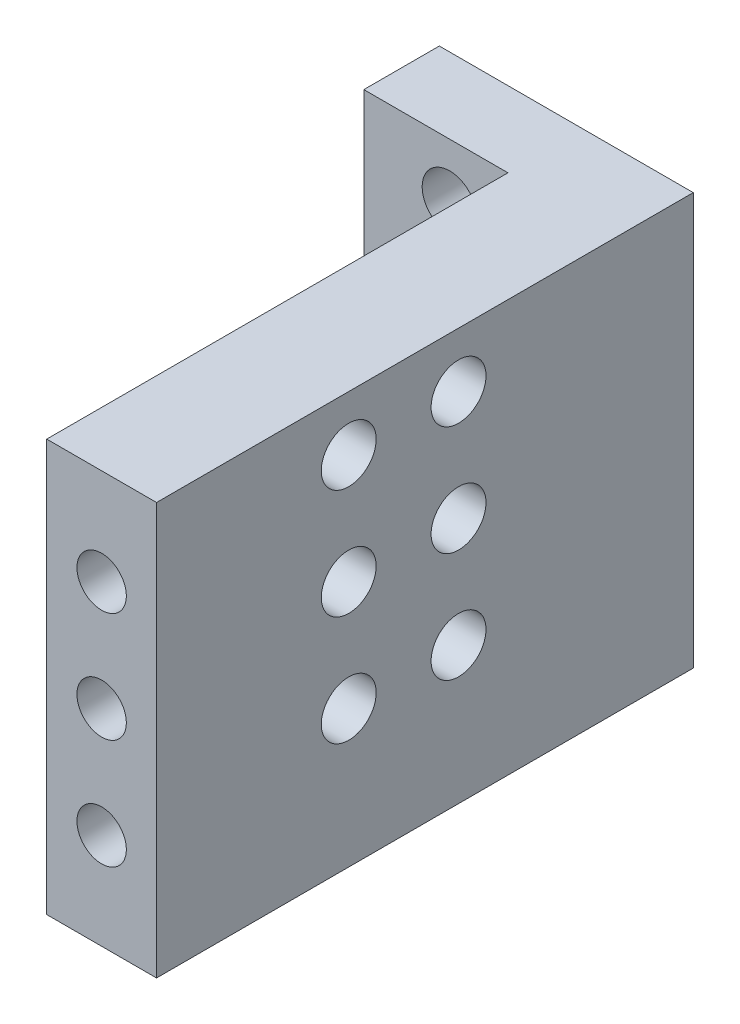
ISO-10303-21;
HEADER;
FILE_DESCRIPTION(('STEP AP214'),'2;1');
FILE_NAME('part.step','',(''),(''),'','','');
FILE_SCHEMA(('AUTOMOTIVE_DESIGN { 1 0 10303 214 1 1 1 1 }'));
ENDSEC;
DATA;
#1=APPLICATION_CONTEXT('core data for automotive mechanical design processes');
#2=APPLICATION_PROTOCOL_DEFINITION('international standard','automotive_design',2000,#1);
#3=PRODUCT_CONTEXT('',#1,'mechanical');
#4=PRODUCT('Part','Part','',(#3));
#5=PRODUCT_RELATED_PRODUCT_CATEGORY('part','',(#4));
#6=PRODUCT_DEFINITION_FORMATION('','',#4);
#7=PRODUCT_DEFINITION_CONTEXT('part definition',#1,'design');
#8=PRODUCT_DEFINITION('design','',#6,#7);
#9=PRODUCT_DEFINITION_SHAPE('','',#8);
#10=(LENGTH_UNIT() NAMED_UNIT(*) SI_UNIT(.MILLI.,.METRE.));
#11=(NAMED_UNIT(*) PLANE_ANGLE_UNIT() SI_UNIT($,.RADIAN.));
#12=(NAMED_UNIT(*) SI_UNIT($,.STERADIAN.) SOLID_ANGLE_UNIT());
#13=UNCERTAINTY_MEASURE_WITH_UNIT(LENGTH_MEASURE(1.E-05),#10,'distance_accuracy_value','');
#14=(GEOMETRIC_REPRESENTATION_CONTEXT(3) GLOBAL_UNCERTAINTY_ASSIGNED_CONTEXT((#13)) GLOBAL_UNIT_ASSIGNED_CONTEXT((#10,
#11,#12)) REPRESENTATION_CONTEXT('',''));
#15=CARTESIAN_POINT('',(0.,0.,0.));
#16=DIRECTION('',(0.,0.,1.));
#17=DIRECTION('',(1.,0.,0.));
#18=AXIS2_PLACEMENT_3D('',#15,#16,#17);
#19=CARTESIAN_POINT('',(8.,30.,0.));
#20=DIRECTION('',(0.,0.,-1.));
#21=DIRECTION('',(-1.,0.,0.));
#22=AXIS2_PLACEMENT_3D('',#19,#20,#21);
#23=PLANE('',#22);
#24=CARTESIAN_POINT('',(4.,23.,0.));
#25=DIRECTION('',(0.,0.,1.));
#26=DIRECTION('',(1.,0.,0.));
#27=AXIS2_PLACEMENT_3D('',#24,#25,#26);
#28=CIRCLE('',#27,1.8);
#29=CARTESIAN_POINT('',(5.8,23.,0.));
#30=VERTEX_POINT('',#29);
#31=EDGE_CURVE('E206',#30,#30,#28,.T.);
#32=ORIENTED_EDGE('',*,*,#31,.F.);
#33=EDGE_LOOP('',(#32));
#34=FACE_BOUND('',#33,.T.);
#35=CARTESIAN_POINT('',(4.,15.,0.));
#36=DIRECTION('',(0.,0.,1.));
#37=DIRECTION('',(1.,0.,0.));
#38=AXIS2_PLACEMENT_3D('',#35,#36,#37);
#39=CIRCLE('',#38,1.8);
#40=CARTESIAN_POINT('',(5.8,15.,0.));
#41=VERTEX_POINT('',#40);
#42=EDGE_CURVE('E210',#41,#41,#39,.T.);
#43=ORIENTED_EDGE('',*,*,#42,.F.);
#44=EDGE_LOOP('',(#43));
#45=FACE_BOUND('',#44,.T.);
#46=CARTESIAN_POINT('',(4.,7.,0.));
#47=DIRECTION('',(0.,0.,1.));
#48=DIRECTION('',(1.,0.,0.));
#49=AXIS2_PLACEMENT_3D('',#46,#47,#48);
#50=CIRCLE('',#49,1.8);
#51=CARTESIAN_POINT('',(5.8,7.,0.));
#52=VERTEX_POINT('',#51);
#53=EDGE_CURVE('E213',#52,#52,#50,.T.);
#54=ORIENTED_EDGE('',*,*,#53,.F.);
#55=EDGE_LOOP('',(#54));
#56=FACE_BOUND('',#55,.T.);
#57=DIRECTION('',(1.,0.,0.));
#58=VECTOR('',#57,1.);
#59=CARTESIAN_POINT('',(8.,0.,0.));
#60=LINE('',#59,#58);
#61=CARTESIAN_POINT('',(0.,0.,0.));
#62=VERTEX_POINT('',#61);
#63=CARTESIAN_POINT('',(8.,0.,0.));
#64=VERTEX_POINT('',#63);
#65=EDGE_CURVE('E120',#62,#64,#60,.T.);
#66=ORIENTED_EDGE('',*,*,#65,.T.);
#67=DIRECTION('',(0.,-1.,0.));
#68=VECTOR('',#67,1.);
#69=CARTESIAN_POINT('',(8.,30.,0.));
#70=LINE('',#69,#68);
#71=CARTESIAN_POINT('',(8.,30.,0.));
#72=VERTEX_POINT('',#71);
#73=EDGE_CURVE('E11',#72,#64,#70,.T.);
#74=ORIENTED_EDGE('',*,*,#73,.F.);
#75=DIRECTION('',(1.,0.,0.));
#76=VECTOR('',#75,1.);
#77=CARTESIAN_POINT('',(8.,30.,0.));
#78=LINE('',#77,#76);
#79=CARTESIAN_POINT('',(0.,30.,0.));
#80=VERTEX_POINT('',#79);
#81=EDGE_CURVE('E131',#80,#72,#78,.T.);
#82=ORIENTED_EDGE('',*,*,#81,.F.);
#83=DIRECTION('',(0.,-1.,0.));
#84=VECTOR('',#83,1.);
#85=CARTESIAN_POINT('',(0.,30.,0.));
#86=LINE('',#85,#84);
#87=EDGE_CURVE('E116',#80,#62,#86,.T.);
#88=ORIENTED_EDGE('',*,*,#87,.T.);
#89=EDGE_LOOP('',(#66,#74,#82,#88));
#90=FACE_BOUND('',#89,.T.);
#91=ADVANCED_FACE('F34',(#34,#45,#56,#90),#23,.F.);
#92=CARTESIAN_POINT('',(8.,30.,-39.1));
#93=DIRECTION('',(-1.,0.,0.));
#94=DIRECTION('',(0.,0.,1.));
#95=AXIS2_PLACEMENT_3D('',#92,#93,#94);
#96=PLANE('',#95);
#97=CARTESIAN_POINT('',(8.,18.,-14.));
#98=DIRECTION('',(1.,0.,0.));
#99=DIRECTION('',(0.,0.,-1.));
#100=AXIS2_PLACEMENT_3D('',#97,#98,#99);
#101=CIRCLE('',#100,2.);
#102=CARTESIAN_POINT('',(8.,18.,-16.));
#103=VERTEX_POINT('',#102);
#104=EDGE_CURVE('E226',#103,#103,#101,.T.);
#105=ORIENTED_EDGE('',*,*,#104,.F.);
#106=EDGE_LOOP('',(#105));
#107=FACE_BOUND('',#106,.T.);
#108=CARTESIAN_POINT('',(8.,10.,-14.));
#109=DIRECTION('',(1.,0.,0.));
#110=DIRECTION('',(0.,0.,-1.));
#111=AXIS2_PLACEMENT_3D('',#108,#109,#110);
#112=CIRCLE('',#111,2.);
#113=CARTESIAN_POINT('',(8.,10.,-16.));
#114=VERTEX_POINT('',#113);
#115=EDGE_CURVE('E229',#114,#114,#112,.T.);
#116=ORIENTED_EDGE('',*,*,#115,.F.);
#117=EDGE_LOOP('',(#116));
#118=FACE_BOUND('',#117,.T.);
#119=CARTESIAN_POINT('',(8.,26.,-22.));
#120=DIRECTION('',(1.,0.,0.));
#121=DIRECTION('',(0.,0.,-1.));
#122=AXIS2_PLACEMENT_3D('',#119,#120,#121);
#123=CIRCLE('',#122,2.00000000000001);
#124=CARTESIAN_POINT('',(8.,26.,-24.));
#125=VERTEX_POINT('',#124);
#126=EDGE_CURVE('E232',#125,#125,#123,.T.);
#127=ORIENTED_EDGE('',*,*,#126,.F.);
#128=EDGE_LOOP('',(#127));
#129=FACE_BOUND('',#128,.T.);
#130=CARTESIAN_POINT('',(8.,18.,-22.));
#131=DIRECTION('',(1.,0.,0.));
#132=DIRECTION('',(0.,0.,-1.));
#133=AXIS2_PLACEMENT_3D('',#130,#131,#132);
#134=CIRCLE('',#133,2.);
#135=CARTESIAN_POINT('',(8.,18.,-24.));
#136=VERTEX_POINT('',#135);
#137=EDGE_CURVE('E224',#136,#136,#134,.T.);
#138=ORIENTED_EDGE('',*,*,#137,.F.);
#139=EDGE_LOOP('',(#138));
#140=FACE_BOUND('',#139,.T.);
#141=CARTESIAN_POINT('',(8.,10.,-22.));
#142=DIRECTION('',(1.,0.,0.));
#143=DIRECTION('',(0.,0.,-1.));
#144=AXIS2_PLACEMENT_3D('',#141,#142,#143);
#145=CIRCLE('',#144,2.);
#146=CARTESIAN_POINT('',(8.,10.,-24.));
#147=VERTEX_POINT('',#146);
#148=EDGE_CURVE('E221',#147,#147,#145,.T.);
#149=ORIENTED_EDGE('',*,*,#148,.F.);
#150=EDGE_LOOP('',(#149));
#151=FACE_BOUND('',#150,.T.);
#152=CARTESIAN_POINT('',(8.,26.,-14.));
#153=DIRECTION('',(1.,0.,0.));
#154=DIRECTION('',(0.,0.,-1.));
#155=AXIS2_PLACEMENT_3D('',#152,#153,#154);
#156=CIRCLE('',#155,2.00000000000001);
#157=CARTESIAN_POINT('',(8.,26.,-16.));
#158=VERTEX_POINT('',#157);
#159=EDGE_CURVE('E150',#158,#158,#156,.T.);
#160=ORIENTED_EDGE('',*,*,#159,.F.);
#161=EDGE_LOOP('',(#160));
#162=FACE_BOUND('',#161,.T.);
#163=DIRECTION('',(0.,0.,-1.));
#164=VECTOR('',#163,1.);
#165=CARTESIAN_POINT('',(8.,0.,-39.1));
#166=LINE('',#165,#164);
#167=CARTESIAN_POINT('',(8.,0.,-39.1));
#168=VERTEX_POINT('',#167);
#169=EDGE_CURVE('E123',#64,#168,#166,.T.);
#170=ORIENTED_EDGE('',*,*,#169,.T.);
#171=DIRECTION('',(0.,-1.,0.));
#172=VECTOR('',#171,1.);
#173=CARTESIAN_POINT('',(8.,30.,-39.1));
#174=LINE('',#173,#172);
#175=CARTESIAN_POINT('',(8.,30.,-39.1));
#176=VERTEX_POINT('',#175);
#177=EDGE_CURVE('E43',#176,#168,#174,.T.);
#178=ORIENTED_EDGE('',*,*,#177,.F.);
#179=DIRECTION('',(0.,0.,-1.));
#180=VECTOR('',#179,1.);
#181=CARTESIAN_POINT('',(8.,30.,-39.1));
#182=LINE('',#181,#180);
#183=EDGE_CURVE('E89',#72,#176,#182,.T.);
#184=ORIENTED_EDGE('',*,*,#183,.F.);
#185=ORIENTED_EDGE('',*,*,#73,.T.);
#186=EDGE_LOOP('',(#170,#178,#184,#185));
#187=FACE_BOUND('',#186,.T.);
#188=ADVANCED_FACE('F178',(#107,#118,#129,#140,#151,#162,#187),#96,.F.);
#189=CARTESIAN_POINT('',(-10.5,30.,-39.1));
#190=DIRECTION('',(0.,0.,1.));
#191=DIRECTION('',(1.,0.,0.));
#192=AXIS2_PLACEMENT_3D('',#189,#190,#191);
#193=PLANE('',#192);
#194=CARTESIAN_POINT('',(-4.25,26.,-39.1));
#195=DIRECTION('',(0.,0.,-1.));
#196=DIRECTION('',(-1.,0.,0.));
#197=AXIS2_PLACEMENT_3D('',#194,#195,#196);
#198=CIRCLE('',#197,2.);
#199=CARTESIAN_POINT('',(-6.25,26.,-39.1));
#200=VERTEX_POINT('',#199);
#201=EDGE_CURVE('E141',#200,#200,#198,.T.);
#202=ORIENTED_EDGE('',*,*,#201,.F.);
#203=EDGE_LOOP('',(#202));
#204=FACE_BOUND('',#203,.T.);
#205=CARTESIAN_POINT('',(-4.25,18.,-39.1));
#206=DIRECTION('',(0.,0.,-1.));
#207=DIRECTION('',(-1.,0.,0.));
#208=AXIS2_PLACEMENT_3D('',#205,#206,#207);
#209=CIRCLE('',#208,2.);
#210=CARTESIAN_POINT('',(-6.25,18.,-39.1));
#211=VERTEX_POINT('',#210);
#212=EDGE_CURVE('E167',#211,#211,#209,.T.);
#213=ORIENTED_EDGE('',*,*,#212,.F.);
#214=EDGE_LOOP('',(#213));
#215=FACE_BOUND('',#214,.T.);
#216=CARTESIAN_POINT('',(-4.25,10.,-39.1));
#217=DIRECTION('',(0.,0.,-1.));
#218=DIRECTION('',(-1.,0.,0.));
#219=AXIS2_PLACEMENT_3D('',#216,#217,#218);
#220=CIRCLE('',#219,2.);
#221=CARTESIAN_POINT('',(-6.25,10.,-39.1));
#222=VERTEX_POINT('',#221);
#223=EDGE_CURVE('E163',#222,#222,#220,.T.);
#224=ORIENTED_EDGE('',*,*,#223,.F.);
#225=EDGE_LOOP('',(#224));
#226=FACE_BOUND('',#225,.T.);
#227=DIRECTION('',(-1.,0.,0.));
#228=VECTOR('',#227,1.);
#229=CARTESIAN_POINT('',(-10.5,0.,-39.1));
#230=LINE('',#229,#228);
#231=CARTESIAN_POINT('',(-10.5,0.,-39.1));
#232=VERTEX_POINT('',#231);
#233=EDGE_CURVE('E126',#168,#232,#230,.T.);
#234=ORIENTED_EDGE('',*,*,#233,.T.);
#235=DIRECTION('',(0.,-1.,0.));
#236=VECTOR('',#235,1.);
#237=CARTESIAN_POINT('',(-10.5,30.,-39.1));
#238=LINE('',#237,#236);
#239=CARTESIAN_POINT('',(-10.5,30.,-39.1));
#240=VERTEX_POINT('',#239);
#241=EDGE_CURVE('E111',#240,#232,#238,.T.);
#242=ORIENTED_EDGE('',*,*,#241,.F.);
#243=DIRECTION('',(-1.,0.,0.));
#244=VECTOR('',#243,1.);
#245=CARTESIAN_POINT('',(-10.5,30.,-39.1));
#246=LINE('',#245,#244);
#247=EDGE_CURVE('E102',#176,#240,#246,.T.);
#248=ORIENTED_EDGE('',*,*,#247,.F.);
#249=ORIENTED_EDGE('',*,*,#177,.T.);
#250=EDGE_LOOP('',(#234,#242,#248,#249));
#251=FACE_BOUND('',#250,.T.);
#252=ADVANCED_FACE('F181',(#204,#215,#226,#251),#193,.F.);
#253=CARTESIAN_POINT('',(-10.5,30.,-33.6));
#254=DIRECTION('',(1.,0.,0.));
#255=DIRECTION('',(0.,0.,-1.));
#256=AXIS2_PLACEMENT_3D('',#253,#254,#255);
#257=PLANE('',#256);
#258=DIRECTION('',(0.,0.,1.));
#259=VECTOR('',#258,1.);
#260=CARTESIAN_POINT('',(-10.5,0.,-33.6));
#261=LINE('',#260,#259);
#262=CARTESIAN_POINT('',(-10.5,0.,-33.6));
#263=VERTEX_POINT('',#262);
#264=EDGE_CURVE('E110',#232,#263,#261,.T.);
#265=ORIENTED_EDGE('',*,*,#264,.T.);
#266=DIRECTION('',(0.,-1.,0.));
#267=VECTOR('',#266,1.);
#268=CARTESIAN_POINT('',(-10.5,30.,-33.6));
#269=LINE('',#268,#267);
#270=CARTESIAN_POINT('',(-10.5,30.,-33.6));
#271=VERTEX_POINT('',#270);
#272=EDGE_CURVE('E107',#271,#263,#269,.T.);
#273=ORIENTED_EDGE('',*,*,#272,.F.);
#274=DIRECTION('',(0.,0.,1.));
#275=VECTOR('',#274,1.);
#276=CARTESIAN_POINT('',(-10.5,30.,-33.6));
#277=LINE('',#276,#275);
#278=EDGE_CURVE('E96',#240,#271,#277,.T.);
#279=ORIENTED_EDGE('',*,*,#278,.F.);
#280=ORIENTED_EDGE('',*,*,#241,.T.);
#281=EDGE_LOOP('',(#265,#273,#279,#280));
#282=FACE_BOUND('',#281,.T.);
#283=ADVANCED_FACE('F108',(#282),#257,.F.);
#284=CARTESIAN_POINT('',(0.,30.,-33.6));
#285=DIRECTION('',(0.,0.,-1.));
#286=DIRECTION('',(-1.,0.,0.));
#287=AXIS2_PLACEMENT_3D('',#284,#285,#286);
#288=PLANE('',#287);
#289=CARTESIAN_POINT('',(-4.25,26.,-33.6));
#290=DIRECTION('',(0.,0.,-1.));
#291=DIRECTION('',(-1.,0.,0.));
#292=AXIS2_PLACEMENT_3D('',#289,#290,#291);
#293=CIRCLE('',#292,2.);
#294=CARTESIAN_POINT('',(-6.25,26.,-33.6));
#295=VERTEX_POINT('',#294);
#296=EDGE_CURVE('E124',#295,#295,#293,.T.);
#297=ORIENTED_EDGE('',*,*,#296,.T.);
#298=EDGE_LOOP('',(#297));
#299=FACE_BOUND('',#298,.T.);
#300=CARTESIAN_POINT('',(-4.25,18.,-33.6));
#301=DIRECTION('',(0.,0.,-1.));
#302=DIRECTION('',(-1.,0.,0.));
#303=AXIS2_PLACEMENT_3D('',#300,#301,#302);
#304=CIRCLE('',#303,2.);
#305=CARTESIAN_POINT('',(-6.25,18.,-33.6));
#306=VERTEX_POINT('',#305);
#307=EDGE_CURVE('E140',#306,#306,#304,.T.);
#308=ORIENTED_EDGE('',*,*,#307,.T.);
#309=EDGE_LOOP('',(#308));
#310=FACE_BOUND('',#309,.T.);
#311=CARTESIAN_POINT('',(-4.25,10.,-33.6));
#312=DIRECTION('',(0.,0.,-1.));
#313=DIRECTION('',(-1.,0.,0.));
#314=AXIS2_PLACEMENT_3D('',#311,#312,#313);
#315=CIRCLE('',#314,2.);
#316=CARTESIAN_POINT('',(-6.25,10.,-33.6));
#317=VERTEX_POINT('',#316);
#318=EDGE_CURVE('E137',#317,#317,#315,.T.);
#319=ORIENTED_EDGE('',*,*,#318,.T.);
#320=EDGE_LOOP('',(#319));
#321=FACE_BOUND('',#320,.T.);
#322=DIRECTION('',(1.,0.,0.));
#323=VECTOR('',#322,1.);
#324=CARTESIAN_POINT('',(0.,0.,-33.6));
#325=LINE('',#324,#323);
#326=CARTESIAN_POINT('',(0.,0.,-33.6));
#327=VERTEX_POINT('',#326);
#328=EDGE_CURVE('E75',#263,#327,#325,.T.);
#329=ORIENTED_EDGE('',*,*,#328,.T.);
#330=DIRECTION('',(0.,-1.,0.));
#331=VECTOR('',#330,1.);
#332=CARTESIAN_POINT('',(0.,30.,-33.6));
#333=LINE('',#332,#331);
#334=CARTESIAN_POINT('',(0.,30.,-33.6));
#335=VERTEX_POINT('',#334);
#336=EDGE_CURVE('E112',#335,#327,#333,.T.);
#337=ORIENTED_EDGE('',*,*,#336,.F.);
#338=DIRECTION('',(1.,0.,0.));
#339=VECTOR('',#338,1.);
#340=CARTESIAN_POINT('',(0.,30.,-33.6));
#341=LINE('',#340,#339);
#342=EDGE_CURVE('E100',#271,#335,#341,.T.);
#343=ORIENTED_EDGE('',*,*,#342,.F.);
#344=ORIENTED_EDGE('',*,*,#272,.T.);
#345=EDGE_LOOP('',(#329,#337,#343,#344));
#346=FACE_BOUND('',#345,.T.);
#347=ADVANCED_FACE('F114',(#299,#310,#321,#346),#288,.F.);
#348=CARTESIAN_POINT('',(0.,30.,0.));
#349=DIRECTION('',(1.,0.,0.));
#350=DIRECTION('',(0.,0.,-1.));
#351=AXIS2_PLACEMENT_3D('',#348,#349,#350);
#352=PLANE('',#351);
#353=CARTESIAN_POINT('',(0.,18.,-14.));
#354=DIRECTION('',(1.,0.,0.));
#355=DIRECTION('',(0.,0.,-1.));
#356=AXIS2_PLACEMENT_3D('',#353,#354,#355);
#357=CIRCLE('',#356,2.);
#358=CARTESIAN_POINT('',(0.,18.,-16.));
#359=VERTEX_POINT('',#358);
#360=EDGE_CURVE('E37',#359,#359,#357,.T.);
#361=ORIENTED_EDGE('',*,*,#360,.T.);
#362=EDGE_LOOP('',(#361));
#363=FACE_BOUND('',#362,.T.);
#364=CARTESIAN_POINT('',(0.,10.,-14.));
#365=DIRECTION('',(1.,0.,0.));
#366=DIRECTION('',(0.,0.,-1.));
#367=AXIS2_PLACEMENT_3D('',#364,#365,#366);
#368=CIRCLE('',#367,2.);
#369=CARTESIAN_POINT('',(0.,10.,-16.));
#370=VERTEX_POINT('',#369);
#371=EDGE_CURVE('E158',#370,#370,#368,.T.);
#372=ORIENTED_EDGE('',*,*,#371,.T.);
#373=EDGE_LOOP('',(#372));
#374=FACE_BOUND('',#373,.T.);
#375=CARTESIAN_POINT('',(0.,26.,-22.));
#376=DIRECTION('',(1.,0.,0.));
#377=DIRECTION('',(0.,0.,-1.));
#378=AXIS2_PLACEMENT_3D('',#375,#376,#377);
#379=CIRCLE('',#378,2.00000000000001);
#380=CARTESIAN_POINT('',(0.,26.,-24.));
#381=VERTEX_POINT('',#380);
#382=EDGE_CURVE('E156',#381,#381,#379,.T.);
#383=ORIENTED_EDGE('',*,*,#382,.T.);
#384=EDGE_LOOP('',(#383));
#385=FACE_BOUND('',#384,.T.);
#386=CARTESIAN_POINT('',(0.,18.,-22.));
#387=DIRECTION('',(1.,0.,0.));
#388=DIRECTION('',(0.,0.,-1.));
#389=AXIS2_PLACEMENT_3D('',#386,#387,#388);
#390=CIRCLE('',#389,2.);
#391=CARTESIAN_POINT('',(0.,18.,-24.));
#392=VERTEX_POINT('',#391);
#393=EDGE_CURVE('E153',#392,#392,#390,.T.);
#394=ORIENTED_EDGE('',*,*,#393,.T.);
#395=EDGE_LOOP('',(#394));
#396=FACE_BOUND('',#395,.T.);
#397=CARTESIAN_POINT('',(0.,10.,-22.));
#398=DIRECTION('',(1.,0.,0.));
#399=DIRECTION('',(0.,0.,-1.));
#400=AXIS2_PLACEMENT_3D('',#397,#398,#399);
#401=CIRCLE('',#400,2.);
#402=CARTESIAN_POINT('',(0.,10.,-24.));
#403=VERTEX_POINT('',#402);
#404=EDGE_CURVE('E149',#403,#403,#401,.T.);
#405=ORIENTED_EDGE('',*,*,#404,.T.);
#406=EDGE_LOOP('',(#405));
#407=FACE_BOUND('',#406,.T.);
#408=CARTESIAN_POINT('',(0.,26.,-14.));
#409=DIRECTION('',(1.,0.,0.));
#410=DIRECTION('',(0.,0.,-1.));
#411=AXIS2_PLACEMENT_3D('',#408,#409,#410);
#412=CIRCLE('',#411,2.00000000000001);
#413=CARTESIAN_POINT('',(0.,26.,-16.));
#414=VERTEX_POINT('',#413);
#415=EDGE_CURVE('E146',#414,#414,#412,.T.);
#416=ORIENTED_EDGE('',*,*,#415,.T.);
#417=EDGE_LOOP('',(#416));
#418=FACE_BOUND('',#417,.T.);
#419=DIRECTION('',(0.,0.,1.));
#420=VECTOR('',#419,1.);
#421=CARTESIAN_POINT('',(0.,0.,0.));
#422=LINE('',#421,#420);
#423=EDGE_CURVE('E81',#327,#62,#422,.T.);
#424=ORIENTED_EDGE('',*,*,#423,.T.);
#425=ORIENTED_EDGE('',*,*,#87,.F.);
#426=DIRECTION('',(0.,0.,1.));
#427=VECTOR('',#426,1.);
#428=CARTESIAN_POINT('',(0.,30.,0.));
#429=LINE('',#428,#427);
#430=EDGE_CURVE('E52',#335,#80,#429,.T.);
#431=ORIENTED_EDGE('',*,*,#430,.F.);
#432=ORIENTED_EDGE('',*,*,#336,.T.);
#433=EDGE_LOOP('',(#424,#425,#431,#432));
#434=FACE_BOUND('',#433,.T.);
#435=ADVANCED_FACE('F186',(#363,#374,#385,#396,#407,#418,#434),#352,.F.);
#436=CARTESIAN_POINT('',(0.,30.,0.));
#437=DIRECTION('',(0.,-1.,0.));
#438=DIRECTION('',(0.,0.,-1.));
#439=AXIS2_PLACEMENT_3D('',#436,#437,#438);
#440=PLANE('',#439);
#441=ORIENTED_EDGE('',*,*,#81,.T.);
#442=ORIENTED_EDGE('',*,*,#183,.T.);
#443=ORIENTED_EDGE('',*,*,#247,.T.);
#444=ORIENTED_EDGE('',*,*,#278,.T.);
#445=ORIENTED_EDGE('',*,*,#342,.T.);
#446=ORIENTED_EDGE('',*,*,#430,.T.);
#447=EDGE_LOOP('',(#441,#442,#443,#444,#445,#446));
#448=FACE_BOUND('',#447,.T.);
#449=ADVANCED_FACE('F98',(#448),#440,.F.);
#450=CARTESIAN_POINT('',(0.,0.,0.));
#451=DIRECTION('',(0.,-1.,0.));
#452=DIRECTION('',(0.,0.,-1.));
#453=AXIS2_PLACEMENT_3D('',#450,#451,#452);
#454=PLANE('',#453);
#455=ORIENTED_EDGE('',*,*,#65,.F.);
#456=ORIENTED_EDGE('',*,*,#423,.F.);
#457=ORIENTED_EDGE('',*,*,#328,.F.);
#458=ORIENTED_EDGE('',*,*,#264,.F.);
#459=ORIENTED_EDGE('',*,*,#233,.F.);
#460=ORIENTED_EDGE('',*,*,#169,.F.);
#461=EDGE_LOOP('',(#455,#456,#457,#458,#459,#460));
#462=FACE_BOUND('',#461,.T.);
#463=ADVANCED_FACE('F184',(#462),#454,.T.);
#464=CARTESIAN_POINT('',(-4.25,10.,-30.1));
#465=DIRECTION('',(0.,0.,-1.));
#466=DIRECTION('',(-1.,0.,0.));
#467=AXIS2_PLACEMENT_3D('',#464,#465,#466);
#468=CYLINDRICAL_SURFACE('',#467,2.);
#469=ORIENTED_EDGE('',*,*,#223,.T.);
#470=EDGE_LOOP('',(#469));
#471=FACE_BOUND('',#470,.T.);
#472=ORIENTED_EDGE('',*,*,#318,.F.);
#473=EDGE_LOOP('',(#472));
#474=FACE_BOUND('',#473,.T.);
#475=ADVANCED_FACE('F253',(#471,#474),#468,.F.);
#476=CARTESIAN_POINT('',(-4.25,18.,-30.1));
#477=DIRECTION('',(0.,0.,-1.));
#478=DIRECTION('',(-1.,0.,0.));
#479=AXIS2_PLACEMENT_3D('',#476,#477,#478);
#480=CYLINDRICAL_SURFACE('',#479,2.);
#481=ORIENTED_EDGE('',*,*,#212,.T.);
#482=EDGE_LOOP('',(#481));
#483=FACE_BOUND('',#482,.T.);
#484=ORIENTED_EDGE('',*,*,#307,.F.);
#485=EDGE_LOOP('',(#484));
#486=FACE_BOUND('',#485,.T.);
#487=ADVANCED_FACE('F250',(#483,#486),#480,.F.);
#488=CARTESIAN_POINT('',(-4.25,26.,-30.1));
#489=DIRECTION('',(0.,0.,-1.));
#490=DIRECTION('',(-1.,0.,0.));
#491=AXIS2_PLACEMENT_3D('',#488,#489,#490);
#492=CYLINDRICAL_SURFACE('',#491,2.);
#493=ORIENTED_EDGE('',*,*,#201,.T.);
#494=EDGE_LOOP('',(#493));
#495=FACE_BOUND('',#494,.T.);
#496=ORIENTED_EDGE('',*,*,#296,.F.);
#497=EDGE_LOOP('',(#496));
#498=FACE_BOUND('',#497,.T.);
#499=ADVANCED_FACE('F241',(#495,#498),#492,.F.);
#500=CARTESIAN_POINT('',(-1.,26.,-14.));
#501=DIRECTION('',(1.,0.,0.));
#502=DIRECTION('',(0.,0.,-1.));
#503=AXIS2_PLACEMENT_3D('',#500,#501,#502);
#504=CYLINDRICAL_SURFACE('',#503,2.00000000000001);
#505=ORIENTED_EDGE('',*,*,#159,.T.);
#506=EDGE_LOOP('',(#505));
#507=FACE_BOUND('',#506,.T.);
#508=ORIENTED_EDGE('',*,*,#415,.F.);
#509=EDGE_LOOP('',(#508));
#510=FACE_BOUND('',#509,.T.);
#511=ADVANCED_FACE('F268',(#507,#510),#504,.F.);
#512=CARTESIAN_POINT('',(-1.,10.,-22.));
#513=DIRECTION('',(1.,0.,0.));
#514=DIRECTION('',(0.,0.,-1.));
#515=AXIS2_PLACEMENT_3D('',#512,#513,#514);
#516=CYLINDRICAL_SURFACE('',#515,2.);
#517=ORIENTED_EDGE('',*,*,#148,.T.);
#518=EDGE_LOOP('',(#517));
#519=FACE_BOUND('',#518,.T.);
#520=ORIENTED_EDGE('',*,*,#404,.F.);
#521=EDGE_LOOP('',(#520));
#522=FACE_BOUND('',#521,.T.);
#523=ADVANCED_FACE('F271',(#519,#522),#516,.F.);
#524=CARTESIAN_POINT('',(-1.,18.,-22.));
#525=DIRECTION('',(1.,0.,0.));
#526=DIRECTION('',(0.,0.,-1.));
#527=AXIS2_PLACEMENT_3D('',#524,#525,#526);
#528=CYLINDRICAL_SURFACE('',#527,2.);
#529=ORIENTED_EDGE('',*,*,#137,.T.);
#530=EDGE_LOOP('',(#529));
#531=FACE_BOUND('',#530,.T.);
#532=ORIENTED_EDGE('',*,*,#393,.F.);
#533=EDGE_LOOP('',(#532));
#534=FACE_BOUND('',#533,.T.);
#535=ADVANCED_FACE('F273',(#531,#534),#528,.F.);
#536=CARTESIAN_POINT('',(-1.,26.,-22.));
#537=DIRECTION('',(1.,0.,0.));
#538=DIRECTION('',(0.,0.,-1.));
#539=AXIS2_PLACEMENT_3D('',#536,#537,#538);
#540=CYLINDRICAL_SURFACE('',#539,2.00000000000001);
#541=ORIENTED_EDGE('',*,*,#126,.T.);
#542=EDGE_LOOP('',(#541));
#543=FACE_BOUND('',#542,.T.);
#544=ORIENTED_EDGE('',*,*,#382,.F.);
#545=EDGE_LOOP('',(#544));
#546=FACE_BOUND('',#545,.T.);
#547=ADVANCED_FACE('F276',(#543,#546),#540,.F.);
#548=CARTESIAN_POINT('',(-1.,10.,-14.));
#549=DIRECTION('',(1.,0.,0.));
#550=DIRECTION('',(0.,0.,-1.));
#551=AXIS2_PLACEMENT_3D('',#548,#549,#550);
#552=CYLINDRICAL_SURFACE('',#551,2.);
#553=ORIENTED_EDGE('',*,*,#115,.T.);
#554=EDGE_LOOP('',(#553));
#555=FACE_BOUND('',#554,.T.);
#556=ORIENTED_EDGE('',*,*,#371,.F.);
#557=EDGE_LOOP('',(#556));
#558=FACE_BOUND('',#557,.T.);
#559=ADVANCED_FACE('F280',(#555,#558),#552,.F.);
#560=CARTESIAN_POINT('',(-1.,18.,-14.));
#561=DIRECTION('',(1.,0.,0.));
#562=DIRECTION('',(0.,0.,-1.));
#563=AXIS2_PLACEMENT_3D('',#560,#561,#562);
#564=CYLINDRICAL_SURFACE('',#563,2.);
#565=ORIENTED_EDGE('',*,*,#104,.T.);
#566=EDGE_LOOP('',(#565));
#567=FACE_BOUND('',#566,.T.);
#568=ORIENTED_EDGE('',*,*,#360,.F.);
#569=EDGE_LOOP('',(#568));
#570=FACE_BOUND('',#569,.T.);
#571=ADVANCED_FACE('F284',(#567,#570),#564,.F.);
#572=CARTESIAN_POINT('',(4.,7.,-9.));
#573=DIRECTION('',(0.,0.,1.));
#574=DIRECTION('',(1.,0.,0.));
#575=AXIS2_PLACEMENT_3D('',#572,#573,#574);
#576=CYLINDRICAL_SURFACE('',#575,1.8);
#577=CARTESIAN_POINT('',(4.,7.,-9.));
#578=DIRECTION('',(0.,0.,1.));
#579=DIRECTION('',(1.,0.,0.));
#580=AXIS2_PLACEMENT_3D('',#577,#578,#579);
#581=CIRCLE('',#580,1.8);
#582=CARTESIAN_POINT('',(5.8,7.,-9.));
#583=VERTEX_POINT('',#582);
#584=EDGE_CURVE('E215',#583,#583,#581,.T.);
#585=ORIENTED_EDGE('',*,*,#584,.F.);
#586=EDGE_LOOP('',(#585));
#587=FACE_BOUND('',#586,.T.);
#588=ORIENTED_EDGE('',*,*,#53,.T.);
#589=EDGE_LOOP('',(#588));
#590=FACE_BOUND('',#589,.T.);
#591=ADVANCED_FACE('F288',(#587,#590),#576,.F.);
#592=CARTESIAN_POINT('',(4.,7.,-9.));
#593=DIRECTION('',(0.,0.,1.));
#594=DIRECTION('',(1.,0.,0.));
#595=AXIS2_PLACEMENT_3D('',#592,#593,#594);
#596=PLANE('',#595);
#597=ORIENTED_EDGE('',*,*,#584,.T.);
#598=EDGE_LOOP('',(#597));
#599=FACE_BOUND('',#598,.T.);
#600=ADVANCED_FACE('F295',(#599),#596,.T.);
#601=CARTESIAN_POINT('',(4.,15.,-9.));
#602=DIRECTION('',(0.,0.,1.));
#603=DIRECTION('',(1.,0.,0.));
#604=AXIS2_PLACEMENT_3D('',#601,#602,#603);
#605=CYLINDRICAL_SURFACE('',#604,1.8);
#606=CARTESIAN_POINT('',(4.,15.,-9.));
#607=DIRECTION('',(0.,0.,1.));
#608=DIRECTION('',(1.,0.,0.));
#609=AXIS2_PLACEMENT_3D('',#606,#607,#608);
#610=CIRCLE('',#609,1.8);
#611=CARTESIAN_POINT('',(5.8,15.,-9.));
#612=VERTEX_POINT('',#611);
#613=EDGE_CURVE('E320',#612,#612,#610,.T.);
#614=ORIENTED_EDGE('',*,*,#613,.F.);
#615=EDGE_LOOP('',(#614));
#616=FACE_BOUND('',#615,.T.);
#617=ORIENTED_EDGE('',*,*,#42,.T.);
#618=EDGE_LOOP('',(#617));
#619=FACE_BOUND('',#618,.T.);
#620=ADVANCED_FACE('F299',(#616,#619),#605,.F.);
#621=CARTESIAN_POINT('',(4.,15.,-9.));
#622=DIRECTION('',(0.,0.,1.));
#623=DIRECTION('',(1.,0.,0.));
#624=AXIS2_PLACEMENT_3D('',#621,#622,#623);
#625=PLANE('',#624);
#626=ORIENTED_EDGE('',*,*,#613,.T.);
#627=EDGE_LOOP('',(#626));
#628=FACE_BOUND('',#627,.T.);
#629=ADVANCED_FACE('F303',(#628),#625,.T.);
#630=CARTESIAN_POINT('',(4.,23.,-9.));
#631=DIRECTION('',(0.,0.,1.));
#632=DIRECTION('',(1.,0.,0.));
#633=AXIS2_PLACEMENT_3D('',#630,#631,#632);
#634=CYLINDRICAL_SURFACE('',#633,1.8);
#635=CARTESIAN_POINT('',(4.,23.,-9.));
#636=DIRECTION('',(0.,0.,1.));
#637=DIRECTION('',(1.,0.,0.));
#638=AXIS2_PLACEMENT_3D('',#635,#636,#637);
#639=CIRCLE('',#638,1.8);
#640=CARTESIAN_POINT('',(5.8,23.,-9.));
#641=VERTEX_POINT('',#640);
#642=EDGE_CURVE('E225',#641,#641,#639,.T.);
#643=ORIENTED_EDGE('',*,*,#642,.F.);
#644=EDGE_LOOP('',(#643));
#645=FACE_BOUND('',#644,.T.);
#646=ORIENTED_EDGE('',*,*,#31,.T.);
#647=EDGE_LOOP('',(#646));
#648=FACE_BOUND('',#647,.T.);
#649=ADVANCED_FACE('F307',(#645,#648),#634,.F.);
#650=CARTESIAN_POINT('',(4.,23.,-9.));
#651=DIRECTION('',(0.,0.,1.));
#652=DIRECTION('',(1.,0.,0.));
#653=AXIS2_PLACEMENT_3D('',#650,#651,#652);
#654=PLANE('',#653);
#655=ORIENTED_EDGE('',*,*,#642,.T.);
#656=EDGE_LOOP('',(#655));
#657=FACE_BOUND('',#656,.T.);
#658=ADVANCED_FACE('F311',(#657),#654,.T.);
#659=CLOSED_SHELL('',(#91,#188,#252,#283,#347,#435,#449,#463,#475,#487,#499,#511,#523,#535,#547,
#559,#571,#591,#600,#620,#629,#649,#658));
#660=MANIFOLD_SOLID_BREP('B2',#659);
#661=ADVANCED_BREP_SHAPE_REPRESENTATION('',(#18,#660),#14);
#662=SHAPE_DEFINITION_REPRESENTATION(#9,#661);
ENDSEC;
END-ISO-10303-21;
